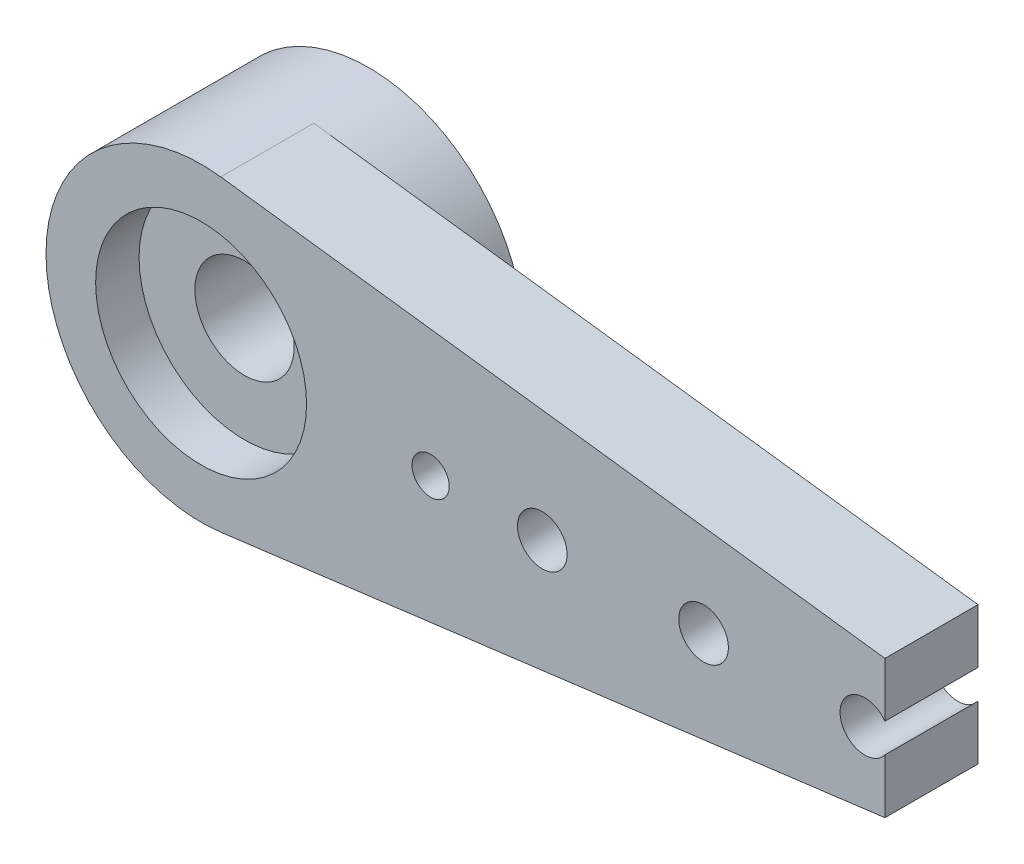
ISO-10303-21;
HEADER;
FILE_DESCRIPTION(('STEP AP214'),'2;1');
FILE_NAME('part.step','',(''),(''),'','','');
FILE_SCHEMA(('AUTOMOTIVE_DESIGN { 1 0 10303 214 1 1 1 1 }'));
ENDSEC;
DATA;
#1=APPLICATION_CONTEXT('core data for automotive mechanical design processes');
#2=APPLICATION_PROTOCOL_DEFINITION('international standard','automotive_design',2000,#1);
#3=PRODUCT_CONTEXT('',#1,'mechanical');
#4=PRODUCT('Part','Part','',(#3));
#5=PRODUCT_RELATED_PRODUCT_CATEGORY('part','',(#4));
#6=PRODUCT_DEFINITION_FORMATION('','',#4);
#7=PRODUCT_DEFINITION_CONTEXT('part definition',#1,'design');
#8=PRODUCT_DEFINITION('design','',#6,#7);
#9=PRODUCT_DEFINITION_SHAPE('','',#8);
#10=(LENGTH_UNIT() NAMED_UNIT(*) SI_UNIT(.MILLI.,.METRE.));
#11=(NAMED_UNIT(*) PLANE_ANGLE_UNIT() SI_UNIT($,.RADIAN.));
#12=(NAMED_UNIT(*) SI_UNIT($,.STERADIAN.) SOLID_ANGLE_UNIT());
#13=UNCERTAINTY_MEASURE_WITH_UNIT(LENGTH_MEASURE(1.E-05),#10,'distance_accuracy_value','');
#14=(GEOMETRIC_REPRESENTATION_CONTEXT(3) GLOBAL_UNCERTAINTY_ASSIGNED_CONTEXT((#13)) GLOBAL_UNIT_ASSIGNED_CONTEXT((#10,
#11,#12)) REPRESENTATION_CONTEXT('',''));
#15=CARTESIAN_POINT('',(0.,0.,0.));
#16=DIRECTION('',(0.,0.,1.));
#17=DIRECTION('',(1.,0.,0.));
#18=AXIS2_PLACEMENT_3D('',#15,#16,#17);
#19=CARTESIAN_POINT('',(0.,0.,1.905));
#20=DIRECTION('',(0.,0.,-1.));
#21=DIRECTION('',(-1.,0.,0.));
#22=AXIS2_PLACEMENT_3D('',#19,#20,#21);
#23=CYLINDRICAL_SURFACE('',#22,1.016);
#24=CARTESIAN_POINT('',(0.,0.,1.016));
#25=DIRECTION('',(0.,0.,1.));
#26=DIRECTION('',(1.,0.,0.));
#27=AXIS2_PLACEMENT_3D('',#24,#25,#26);
#28=CIRCLE('',#27,1.016);
#29=CARTESIAN_POINT('',(1.016,0.,1.016));
#30=VERTEX_POINT('',#29);
#31=EDGE_CURVE('E166',#30,#30,#28,.F.);
#32=ORIENTED_EDGE('',*,*,#31,.F.);
#33=EDGE_LOOP('',(#32));
#34=FACE_BOUND('',#33,.T.);
#35=CARTESIAN_POINT('',(0.,0.,-0.635));
#36=DIRECTION('',(0.,0.,-1.));
#37=DIRECTION('',(-1.,0.,0.));
#38=AXIS2_PLACEMENT_3D('',#35,#36,#37);
#39=CIRCLE('',#38,1.016);
#40=CARTESIAN_POINT('',(-1.016,0.,-0.635));
#41=VERTEX_POINT('',#40);
#42=EDGE_CURVE('E175',#41,#41,#39,.T.);
#43=ORIENTED_EDGE('',*,*,#42,.T.);
#44=EDGE_LOOP('',(#43));
#45=FACE_BOUND('',#44,.T.);
#46=ADVANCED_FACE('F43',(#34,#45),#23,.F.);
#47=CARTESIAN_POINT('',(0.,0.,1.905));
#48=DIRECTION('',(0.,0.,-1.));
#49=DIRECTION('',(-1.,0.,0.));
#50=AXIS2_PLACEMENT_3D('',#47,#48,#49);
#51=CYLINDRICAL_SURFACE('',#50,3.175);
#52=DIRECTION('',(0.,0.,-1.));
#53=VECTOR('',#52,1.);
#54=CARTESIAN_POINT('',(0.402335264301231,3.14940491761533,1.905));
#55=LINE('',#54,#53);
#56=CARTESIAN_POINT('',(0.402335264301231,3.14940491761533,1.905));
#57=VERTEX_POINT('',#56);
#58=CARTESIAN_POINT('',(0.402335264301231,3.14940491761533,0.));
#59=VERTEX_POINT('',#58);
#60=EDGE_CURVE('E137',#57,#59,#55,.T.);
#61=ORIENTED_EDGE('',*,*,#60,.T.);
#62=CARTESIAN_POINT('',(0.,0.,0.));
#63=DIRECTION('',(0.,0.,1.));
#64=DIRECTION('',(1.,0.,0.));
#65=AXIS2_PLACEMENT_3D('',#62,#63,#64);
#66=CIRCLE('',#65,3.175);
#67=CARTESIAN_POINT('',(0.402335264301231,-3.14940491761533,0.));
#68=VERTEX_POINT('',#67);
#69=EDGE_CURVE('E157',#68,#59,#66,.T.);
#70=ORIENTED_EDGE('',*,*,#69,.F.);
#71=DIRECTION('',(0.,0.,-1.));
#72=VECTOR('',#71,1.);
#73=CARTESIAN_POINT('',(0.402335264301231,-3.14940491761533,1.905));
#74=LINE('',#73,#72);
#75=CARTESIAN_POINT('',(0.402335264301231,-3.14940491761533,1.905));
#76=VERTEX_POINT('',#75);
#77=EDGE_CURVE('E156',#76,#68,#74,.T.);
#78=ORIENTED_EDGE('',*,*,#77,.F.);
#79=CARTESIAN_POINT('',(0.,0.,1.905));
#80=DIRECTION('',(0.,0.,1.));
#81=DIRECTION('',(1.,0.,0.));
#82=AXIS2_PLACEMENT_3D('',#79,#80,#81);
#83=CIRCLE('',#82,3.175);
#84=EDGE_CURVE('E116',#57,#76,#83,.T.);
#85=ORIENTED_EDGE('',*,*,#84,.F.);
#86=EDGE_LOOP('',(#61,#70,#78,#85));
#87=FACE_BOUND('',#86,.T.);
#88=CARTESIAN_POINT('',(0.,0.,-1.524));
#89=DIRECTION('',(0.,0.,1.));
#90=DIRECTION('',(1.,0.,0.));
#91=AXIS2_PLACEMENT_3D('',#88,#89,#90);
#92=CIRCLE('',#91,3.175);
#93=CARTESIAN_POINT('',(3.175,0.,-1.524));
#94=VERTEX_POINT('',#93);
#95=EDGE_CURVE('E140',#94,#94,#92,.T.);
#96=ORIENTED_EDGE('',*,*,#95,.T.);
#97=EDGE_LOOP('',(#96));
#98=FACE_BOUND('',#97,.T.);
#99=ADVANCED_FACE('F201',(#87,#98),#51,.T.);
#100=CARTESIAN_POINT('',(0.402335264301231,-3.14940491761533,1.905));
#101=DIRECTION('',(-0.126719768283852,0.99193855672924,0.));
#102=DIRECTION('',(-0.99193855672924,-0.126719768283852,0.));
#103=AXIS2_PLACEMENT_3D('',#100,#101,#102);
#104=PLANE('',#103);
#105=DIRECTION('',(0.99193855672924,0.126719768283852,0.));
#106=VECTOR('',#105,1.);
#107=CARTESIAN_POINT('',(0.402335264301231,-3.14940491761533,0.));
#108=LINE('',#107,#106);
#109=CARTESIAN_POINT('',(14.,-1.41230848878926,0.));
#110=VERTEX_POINT('',#109);
#111=EDGE_CURVE('E109',#68,#110,#108,.T.);
#112=ORIENTED_EDGE('',*,*,#111,.T.);
#113=DIRECTION('',(0.,0.,-1.));
#114=VECTOR('',#113,1.);
#115=CARTESIAN_POINT('',(14.,-1.41230848878926,1.905));
#116=LINE('',#115,#114);
#117=CARTESIAN_POINT('',(14.,-1.41230848878926,1.905));
#118=VERTEX_POINT('',#117);
#119=EDGE_CURVE('E64',#118,#110,#116,.T.);
#120=ORIENTED_EDGE('',*,*,#119,.F.);
#121=DIRECTION('',(0.99193855672924,0.126719768283852,0.));
#122=VECTOR('',#121,1.);
#123=CARTESIAN_POINT('',(0.402335264301231,-3.14940491761533,1.905));
#124=LINE('',#123,#122);
#125=EDGE_CURVE('E106',#76,#118,#124,.T.);
#126=ORIENTED_EDGE('',*,*,#125,.F.);
#127=ORIENTED_EDGE('',*,*,#77,.T.);
#128=EDGE_LOOP('',(#112,#120,#126,#127));
#129=FACE_BOUND('',#128,.T.);
#130=ADVANCED_FACE('F104',(#129),#104,.F.);
#131=CARTESIAN_POINT('',(6.985,0.,1.905));
#132=DIRECTION('',(0.,0.,-1.));
#133=DIRECTION('',(-1.,0.,0.));
#134=AXIS2_PLACEMENT_3D('',#131,#132,#133);
#135=CYLINDRICAL_SURFACE('',#134,0.508);
#136=CARTESIAN_POINT('',(6.985,0.,1.905));
#137=DIRECTION('',(0.,0.,1.));
#138=DIRECTION('',(1.,0.,0.));
#139=AXIS2_PLACEMENT_3D('',#136,#137,#138);
#140=CIRCLE('',#139,0.508);
#141=CARTESIAN_POINT('',(7.493,0.,1.905));
#142=VERTEX_POINT('',#141);
#143=EDGE_CURVE('E131',#142,#142,#140,.T.);
#144=ORIENTED_EDGE('',*,*,#143,.T.);
#145=EDGE_LOOP('',(#144));
#146=FACE_BOUND('',#145,.T.);
#147=CARTESIAN_POINT('',(6.985,0.,0.));
#148=DIRECTION('',(0.,0.,1.));
#149=DIRECTION('',(1.,0.,0.));
#150=AXIS2_PLACEMENT_3D('',#147,#148,#149);
#151=CIRCLE('',#150,0.508);
#152=CARTESIAN_POINT('',(7.493,0.,0.));
#153=VERTEX_POINT('',#152);
#154=EDGE_CURVE('E149',#153,#153,#151,.T.);
#155=ORIENTED_EDGE('',*,*,#154,.F.);
#156=EDGE_LOOP('',(#155));
#157=FACE_BOUND('',#156,.T.);
#158=ADVANCED_FACE('F245',(#146,#157),#135,.F.);
#159=CARTESIAN_POINT('',(10.287,0.,1.905));
#160=DIRECTION('',(0.,0.,-1.));
#161=DIRECTION('',(-1.,0.,0.));
#162=AXIS2_PLACEMENT_3D('',#159,#160,#161);
#163=CYLINDRICAL_SURFACE('',#162,0.508);
#164=CARTESIAN_POINT('',(10.287,0.,1.905));
#165=DIRECTION('',(0.,0.,1.));
#166=DIRECTION('',(1.,0.,0.));
#167=AXIS2_PLACEMENT_3D('',#164,#165,#166);
#168=CIRCLE('',#167,0.508);
#169=CARTESIAN_POINT('',(10.795,0.,1.905));
#170=VERTEX_POINT('',#169);
#171=EDGE_CURVE('E128',#170,#170,#168,.T.);
#172=ORIENTED_EDGE('',*,*,#171,.T.);
#173=EDGE_LOOP('',(#172));
#174=FACE_BOUND('',#173,.T.);
#175=CARTESIAN_POINT('',(10.287,0.,0.));
#176=DIRECTION('',(0.,0.,1.));
#177=DIRECTION('',(1.,0.,0.));
#178=AXIS2_PLACEMENT_3D('',#175,#176,#177);
#179=CIRCLE('',#178,0.508);
#180=CARTESIAN_POINT('',(10.795,0.,0.));
#181=VERTEX_POINT('',#180);
#182=EDGE_CURVE('E146',#181,#181,#179,.T.);
#183=ORIENTED_EDGE('',*,*,#182,.F.);
#184=EDGE_LOOP('',(#183));
#185=FACE_BOUND('',#184,.T.);
#186=ADVANCED_FACE('F248',(#174,#185),#163,.F.);
#187=CARTESIAN_POINT('',(13.589,0.,1.905));
#188=DIRECTION('',(0.,0.,-1.));
#189=DIRECTION('',(-1.,0.,0.));
#190=AXIS2_PLACEMENT_3D('',#187,#188,#189);
#191=CYLINDRICAL_SURFACE('',#190,0.508);
#192=DIRECTION('',(0.,0.,-1.));
#193=VECTOR('',#192,1.);
#194=CARTESIAN_POINT('',(14.,0.298568250153964,1.905));
#195=LINE('',#194,#193);
#196=CARTESIAN_POINT('',(14.,0.298568250153964,1.905));
#197=VERTEX_POINT('',#196);
#198=CARTESIAN_POINT('',(14.,0.298568250153964,0.));
#199=VERTEX_POINT('',#198);
#200=EDGE_CURVE('E57',#197,#199,#195,.T.);
#201=ORIENTED_EDGE('',*,*,#200,.F.);
#202=CARTESIAN_POINT('',(13.589,0.,1.905));
#203=DIRECTION('',(0.,0.,1.));
#204=DIRECTION('',(1.,0.,0.));
#205=AXIS2_PLACEMENT_3D('',#202,#203,#204);
#206=CIRCLE('',#205,0.508);
#207=CARTESIAN_POINT('',(14.,-0.298568250153964,1.905));
#208=VERTEX_POINT('',#207);
#209=EDGE_CURVE('E121',#197,#208,#206,.T.);
#210=ORIENTED_EDGE('',*,*,#209,.T.);
#211=DIRECTION('',(0.,0.,-1.));
#212=VECTOR('',#211,1.);
#213=CARTESIAN_POINT('',(14.,-0.298568250153964,1.905));
#214=LINE('',#213,#212);
#215=CARTESIAN_POINT('',(14.,-0.298568250153964,0.));
#216=VERTEX_POINT('',#215);
#217=EDGE_CURVE('E95',#208,#216,#214,.T.);
#218=ORIENTED_EDGE('',*,*,#217,.T.);
#219=CARTESIAN_POINT('',(13.589,0.,0.));
#220=DIRECTION('',(0.,0.,1.));
#221=DIRECTION('',(1.,0.,0.));
#222=AXIS2_PLACEMENT_3D('',#219,#220,#221);
#223=CIRCLE('',#222,0.508);
#224=EDGE_CURVE('E143',#199,#216,#223,.T.);
#225=ORIENTED_EDGE('',*,*,#224,.F.);
#226=EDGE_LOOP('',(#201,#210,#218,#225));
#227=FACE_BOUND('',#226,.T.);
#228=ADVANCED_FACE('F191',(#227),#191,.F.);
#229=CARTESIAN_POINT('',(0.402335264301231,3.14940491761533,1.905));
#230=DIRECTION('',(0.126719768283852,0.99193855672924,0.));
#231=DIRECTION('',(-0.99193855672924,0.126719768283852,0.));
#232=AXIS2_PLACEMENT_3D('',#229,#230,#231);
#233=PLANE('',#232);
#234=DIRECTION('',(0.,0.,-1.));
#235=VECTOR('',#234,1.);
#236=CARTESIAN_POINT('',(14.,1.41230848878926,1.905));
#237=LINE('',#236,#235);
#238=CARTESIAN_POINT('',(14.,1.41230848878926,1.905));
#239=VERTEX_POINT('',#238);
#240=CARTESIAN_POINT('',(14.,1.41230848878926,0.));
#241=VERTEX_POINT('',#240);
#242=EDGE_CURVE('E179',#239,#241,#237,.T.);
#243=ORIENTED_EDGE('',*,*,#242,.T.);
#244=DIRECTION('',(0.99193855672924,-0.126719768283852,0.));
#245=VECTOR('',#244,1.);
#246=CARTESIAN_POINT('',(0.402335264301231,3.14940491761533,0.));
#247=LINE('',#246,#245);
#248=EDGE_CURVE('E139',#59,#241,#247,.T.);
#249=ORIENTED_EDGE('',*,*,#248,.F.);
#250=ORIENTED_EDGE('',*,*,#60,.F.);
#251=DIRECTION('',(0.99193855672924,-0.126719768283852,0.));
#252=VECTOR('',#251,1.);
#253=CARTESIAN_POINT('',(0.402335264301231,3.14940491761533,1.905));
#254=LINE('',#253,#252);
#255=EDGE_CURVE('E118',#57,#239,#254,.T.);
#256=ORIENTED_EDGE('',*,*,#255,.T.);
#257=EDGE_LOOP('',(#243,#249,#250,#256));
#258=FACE_BOUND('',#257,.T.);
#259=ADVANCED_FACE('F186',(#258),#233,.T.);
#260=CARTESIAN_POINT('',(4.699,0.,1.905));
#261=DIRECTION('',(0.,0.,-1.));
#262=DIRECTION('',(-1.,0.,0.));
#263=AXIS2_PLACEMENT_3D('',#260,#261,#262);
#264=CYLINDRICAL_SURFACE('',#263,0.381000000000001);
#265=CARTESIAN_POINT('',(4.699,0.,1.905));
#266=DIRECTION('',(0.,0.,1.));
#267=DIRECTION('',(1.,0.,0.));
#268=AXIS2_PLACEMENT_3D('',#265,#266,#267);
#269=CIRCLE('',#268,0.381000000000001);
#270=CARTESIAN_POINT('',(5.08,0.,1.905));
#271=VERTEX_POINT('',#270);
#272=EDGE_CURVE('E134',#271,#271,#269,.T.);
#273=ORIENTED_EDGE('',*,*,#272,.T.);
#274=EDGE_LOOP('',(#273));
#275=FACE_BOUND('',#274,.T.);
#276=CARTESIAN_POINT('',(4.699,0.,0.));
#277=DIRECTION('',(0.,0.,1.));
#278=DIRECTION('',(1.,0.,0.));
#279=AXIS2_PLACEMENT_3D('',#276,#277,#278);
#280=CIRCLE('',#279,0.381000000000001);
#281=CARTESIAN_POINT('',(5.08,0.,0.));
#282=VERTEX_POINT('',#281);
#283=EDGE_CURVE('E123',#282,#282,#280,.T.);
#284=ORIENTED_EDGE('',*,*,#283,.F.);
#285=EDGE_LOOP('',(#284));
#286=FACE_BOUND('',#285,.T.);
#287=ADVANCED_FACE('F240',(#275,#286),#264,.F.);
#288=CARTESIAN_POINT('',(0.,0.,1.905));
#289=DIRECTION('',(0.,0.,1.));
#290=DIRECTION('',(1.,0.,0.));
#291=AXIS2_PLACEMENT_3D('',#288,#289,#290);
#292=PLANE('',#291);
#293=DIRECTION('',(0.,1.,0.));
#294=VECTOR('',#293,1.);
#295=CARTESIAN_POINT('',(14.,0.,1.905));
#296=LINE('',#295,#294);
#297=EDGE_CURVE('E100',#197,#239,#296,.T.);
#298=ORIENTED_EDGE('',*,*,#297,.T.);
#299=ORIENTED_EDGE('',*,*,#255,.F.);
#300=ORIENTED_EDGE('',*,*,#84,.T.);
#301=ORIENTED_EDGE('',*,*,#125,.T.);
#302=EDGE_CURVE('E92',#118,#208,#296,.T.);
#303=ORIENTED_EDGE('',*,*,#302,.T.);
#304=ORIENTED_EDGE('',*,*,#209,.F.);
#305=EDGE_LOOP('',(#298,#299,#300,#301,#303,#304));
#306=FACE_BOUND('',#305,.T.);
#307=CARTESIAN_POINT('',(0.,0.,1.905));
#308=DIRECTION('',(0.,0.,1.));
#309=DIRECTION('',(1.,0.,0.));
#310=AXIS2_PLACEMENT_3D('',#307,#308,#309);
#311=CIRCLE('',#310,2.15899987554);
#312=CARTESIAN_POINT('',(2.15899987554,0.,1.905));
#313=VERTEX_POINT('',#312);
#314=EDGE_CURVE('E163',#313,#313,#311,.T.);
#315=ORIENTED_EDGE('',*,*,#314,.F.);
#316=EDGE_LOOP('',(#315));
#317=FACE_BOUND('',#316,.T.);
#318=ORIENTED_EDGE('',*,*,#171,.F.);
#319=EDGE_LOOP('',(#318));
#320=FACE_BOUND('',#319,.T.);
#321=ORIENTED_EDGE('',*,*,#143,.F.);
#322=EDGE_LOOP('',(#321));
#323=FACE_BOUND('',#322,.T.);
#324=ORIENTED_EDGE('',*,*,#272,.F.);
#325=EDGE_LOOP('',(#324));
#326=FACE_BOUND('',#325,.T.);
#327=ADVANCED_FACE('F112',(#306,#317,#320,#323,#326),#292,.T.);
#328=CARTESIAN_POINT('',(0.,0.,0.));
#329=DIRECTION('',(0.,0.,1.));
#330=DIRECTION('',(1.,0.,0.));
#331=AXIS2_PLACEMENT_3D('',#328,#329,#330);
#332=PLANE('',#331);
#333=ORIENTED_EDGE('',*,*,#248,.T.);
#334=DIRECTION('',(0.,-1.,0.));
#335=VECTOR('',#334,1.);
#336=CARTESIAN_POINT('',(14.,0.,0.));
#337=LINE('',#336,#335);
#338=EDGE_CURVE('E11',#241,#199,#337,.T.);
#339=ORIENTED_EDGE('',*,*,#338,.T.);
#340=ORIENTED_EDGE('',*,*,#224,.T.);
#341=DIRECTION('',(0.,-1.,0.));
#342=VECTOR('',#341,1.);
#343=CARTESIAN_POINT('',(14.,0.,0.));
#344=LINE('',#343,#342);
#345=EDGE_CURVE('E50',#216,#110,#344,.T.);
#346=ORIENTED_EDGE('',*,*,#345,.T.);
#347=ORIENTED_EDGE('',*,*,#111,.F.);
#348=ORIENTED_EDGE('',*,*,#69,.T.);
#349=EDGE_LOOP('',(#333,#339,#340,#346,#347,#348));
#350=FACE_BOUND('',#349,.T.);
#351=ORIENTED_EDGE('',*,*,#182,.T.);
#352=EDGE_LOOP('',(#351));
#353=FACE_BOUND('',#352,.T.);
#354=ORIENTED_EDGE('',*,*,#154,.T.);
#355=EDGE_LOOP('',(#354));
#356=FACE_BOUND('',#355,.T.);
#357=ORIENTED_EDGE('',*,*,#283,.T.);
#358=EDGE_LOOP('',(#357));
#359=FACE_BOUND('',#358,.T.);
#360=ADVANCED_FACE('F187',(#350,#353,#356,#359),#332,.F.);
#361=CARTESIAN_POINT('',(0.,0.,-1.524));
#362=DIRECTION('',(0.,0.,1.));
#363=DIRECTION('',(1.,0.,0.));
#364=AXIS2_PLACEMENT_3D('',#361,#362,#363);
#365=PLANE('',#364);
#366=CARTESIAN_POINT('',(0.,0.,-1.524));
#367=DIRECTION('',(0.,0.,-1.));
#368=DIRECTION('',(-1.,0.,0.));
#369=AXIS2_PLACEMENT_3D('',#366,#367,#368);
#370=CIRCLE('',#369,2.09550000254);
#371=CARTESIAN_POINT('',(-2.09550000254,0.,-1.524));
#372=VERTEX_POINT('',#371);
#373=EDGE_CURVE('E172',#372,#372,#370,.T.);
#374=ORIENTED_EDGE('',*,*,#373,.F.);
#375=EDGE_LOOP('',(#374));
#376=FACE_BOUND('',#375,.T.);
#377=ORIENTED_EDGE('',*,*,#95,.F.);
#378=EDGE_LOOP('',(#377));
#379=FACE_BOUND('',#378,.T.);
#380=ADVANCED_FACE('F224',(#376,#379),#365,.F.);
#381=CARTESIAN_POINT('',(0.,0.,1.016));
#382=DIRECTION('',(0.,0.,1.));
#383=DIRECTION('',(1.,0.,0.));
#384=AXIS2_PLACEMENT_3D('',#381,#382,#383);
#385=CYLINDRICAL_SURFACE('',#384,2.15899987554);
#386=CARTESIAN_POINT('',(0.,0.,1.016));
#387=DIRECTION('',(0.,0.,1.));
#388=DIRECTION('',(1.,0.,0.));
#389=AXIS2_PLACEMENT_3D('',#386,#387,#388);
#390=CIRCLE('',#389,2.15899987554);
#391=CARTESIAN_POINT('',(2.15899987554,0.,1.016));
#392=VERTEX_POINT('',#391);
#393=EDGE_CURVE('E162',#392,#392,#390,.T.);
#394=CARTESIAN_POINT('',(2.15899987554,0.,1.016));
#395=CARTESIAN_POINT('',(2.15899987554,0.,1.02526041666667));
#396=CARTESIAN_POINT('',(2.15899987554,0.,1.03452083333333));
#397=CARTESIAN_POINT('',(2.15899987554,0.,1.05304166666667));
#398=CARTESIAN_POINT('',(2.15899987554,0.,1.06230208333333));
#399=CARTESIAN_POINT('',(2.15899987554,0.,1.08082291666667));
#400=CARTESIAN_POINT('',(2.15899987554,0.,1.09008333333333));
#401=CARTESIAN_POINT('',(2.15899987554,0.,1.10860416666667));
#402=CARTESIAN_POINT('',(2.15899987554,0.,1.11786458333333));
#403=CARTESIAN_POINT('',(2.15899987554,0.,1.13638541666667));
#404=CARTESIAN_POINT('',(2.15899987554,0.,1.14564583333333));
#405=CARTESIAN_POINT('',(2.15899987554,0.,1.16416666666667));
#406=CARTESIAN_POINT('',(2.15899987554,0.,1.17342708333333));
#407=CARTESIAN_POINT('',(2.15899987554,0.,1.19194791666667));
#408=CARTESIAN_POINT('',(2.15899987554,0.,1.20120833333333));
#409=CARTESIAN_POINT('',(2.15899987554,0.,1.21972916666667));
#410=CARTESIAN_POINT('',(2.15899987554,0.,1.22898958333333));
#411=CARTESIAN_POINT('',(2.15899987554,0.,1.24751041666667));
#412=CARTESIAN_POINT('',(2.15899987554,0.,1.25677083333333));
#413=CARTESIAN_POINT('',(2.15899987554,0.,1.27529166666667));
#414=CARTESIAN_POINT('',(2.15899987554,0.,1.28455208333333));
#415=CARTESIAN_POINT('',(2.15899987554,0.,1.30307291666667));
#416=CARTESIAN_POINT('',(2.15899987554,0.,1.31233333333333));
#417=CARTESIAN_POINT('',(2.15899987554,0.,1.33085416666667));
#418=CARTESIAN_POINT('',(2.15899987554,0.,1.34011458333333));
#419=CARTESIAN_POINT('',(2.15899987554,0.,1.35863541666667));
#420=CARTESIAN_POINT('',(2.15899987554,0.,1.36789583333333));
#421=CARTESIAN_POINT('',(2.15899987554,0.,1.38641666666667));
#422=CARTESIAN_POINT('',(2.15899987554,0.,1.39567708333333));
#423=CARTESIAN_POINT('',(2.15899987554,0.,1.41419791666667));
#424=CARTESIAN_POINT('',(2.15899987554,0.,1.42345833333333));
#425=CARTESIAN_POINT('',(2.15899987554,0.,1.44197916666667));
#426=CARTESIAN_POINT('',(2.15899987554,0.,1.45123958333333));
#427=CARTESIAN_POINT('',(2.15899987554,0.,1.46976041666667));
#428=CARTESIAN_POINT('',(2.15899987554,0.,1.47902083333333));
#429=CARTESIAN_POINT('',(2.15899987554,0.,1.49754166666667));
#430=CARTESIAN_POINT('',(2.15899987554,0.,1.50680208333333));
#431=CARTESIAN_POINT('',(2.15899987554,0.,1.52532291666667));
#432=CARTESIAN_POINT('',(2.15899987554,0.,1.53458333333333));
#433=CARTESIAN_POINT('',(2.15899987554,0.,1.55310416666667));
#434=CARTESIAN_POINT('',(2.15899987554,0.,1.56236458333333));
#435=CARTESIAN_POINT('',(2.15899987554,0.,1.58088541666667));
#436=CARTESIAN_POINT('',(2.15899987554,0.,1.59014583333333));
#437=CARTESIAN_POINT('',(2.15899987554,0.,1.60866666666667));
#438=CARTESIAN_POINT('',(2.15899987554,0.,1.61792708333333));
#439=CARTESIAN_POINT('',(2.15899987554,0.,1.63644791666667));
#440=CARTESIAN_POINT('',(2.15899987554,0.,1.64570833333333));
#441=CARTESIAN_POINT('',(2.15899987554,0.,1.66422916666667));
#442=CARTESIAN_POINT('',(2.15899987554,0.,1.67348958333333));
#443=CARTESIAN_POINT('',(2.15899987554,0.,1.69201041666667));
#444=CARTESIAN_POINT('',(2.15899987554,0.,1.70127083333333));
#445=CARTESIAN_POINT('',(2.15899987554,0.,1.71979166666667));
#446=CARTESIAN_POINT('',(2.15899987554,0.,1.72905208333333));
#447=CARTESIAN_POINT('',(2.15899987554,0.,1.74757291666667));
#448=CARTESIAN_POINT('',(2.15899987554,0.,1.75683333333333));
#449=CARTESIAN_POINT('',(2.15899987554,0.,1.77535416666667));
#450=CARTESIAN_POINT('',(2.15899987554,0.,1.78461458333333));
#451=CARTESIAN_POINT('',(2.15899987554,0.,1.80313541666667));
#452=CARTESIAN_POINT('',(2.15899987554,0.,1.81239583333333));
#453=CARTESIAN_POINT('',(2.15899987554,0.,1.83091666666667));
#454=CARTESIAN_POINT('',(2.15899987554,0.,1.84017708333333));
#455=CARTESIAN_POINT('',(2.15899987554,0.,1.85869791666667));
#456=CARTESIAN_POINT('',(2.15899987554,0.,1.86795833333333));
#457=CARTESIAN_POINT('',(2.15899987554,0.,1.88647916666667));
#458=CARTESIAN_POINT('',(2.15899987554,0.,1.89573958333333));
#459=CARTESIAN_POINT('',(2.15899987554,0.,1.905));
#460=B_SPLINE_CURVE_WITH_KNOTS('',3,(#394,#395,#396,#397,#398,#399,#400,#401,#402,#403,#404,
#405,#406,#407,#408,#409,#410,#411,#412,#413,#414,#415,#416,#417,#418,#419,#420,#421,#422,#423,
#424,#425,#426,#427,#428,#429,#430,#431,#432,#433,#434,#435,#436,#437,#438,#439,#440,#441,#442,
#443,#444,#445,#446,#447,#448,#449,#450,#451,#452,#453,#454,#455,#456,#457,#458,#459),
.UNSPECIFIED.,.F.,.F.,(4,2,2,2,2,2,2,2,2,2,2,2,2,2,2,2,2,2,2,2,2,2,2,2,2,2,2,2,2,2,2,2,4),(0.,
0.02778125,0.0555625000000001,0.0833437500000001,0.111125,0.13890625,0.1666875,0.19446875,
0.22225,0.25003125,0.2778125,0.30559375,0.333375,0.36115625,0.3889375,0.41671875,0.4445,
0.47228125,0.5000625,0.52784375,0.555625,0.58340625,0.6111875,0.63896875,0.66675,0.69453125,
0.7223125,0.75009375,0.777875,0.80565625,0.8334375,0.86121875,0.889),.UNSPECIFIED.);
#461=EDGE_CURVE('BSEAM226',#392,#313,#460,.T.);
#462=ORIENTED_EDGE('',*,*,#393,.F.);
#463=ORIENTED_EDGE('',*,*,#314,.T.);
#464=ORIENTED_EDGE('',*,*,#461,.T.);
#465=ORIENTED_EDGE('',*,*,#461,.F.);
#466=EDGE_LOOP('',(#462,#464,#463,#465));
#467=FACE_BOUND('',#466,.T.);
#468=ADVANCED_FACE('F226',(#467),#385,.F.);
#469=CARTESIAN_POINT('',(0.,0.,1.016));
#470=DIRECTION('',(0.,0.,1.));
#471=DIRECTION('',(1.,0.,0.));
#472=AXIS2_PLACEMENT_3D('',#469,#470,#471);
#473=PLANE('',#472);
#474=ORIENTED_EDGE('',*,*,#31,.T.);
#475=EDGE_LOOP('',(#474));
#476=FACE_BOUND('',#475,.T.);
#477=ORIENTED_EDGE('',*,*,#393,.T.);
#478=EDGE_LOOP('',(#477));
#479=FACE_BOUND('',#478,.T.);
#480=ADVANCED_FACE('F220',(#476,#479),#473,.T.);
#481=CARTESIAN_POINT('',(0.,0.,-0.635));
#482=DIRECTION('',(0.,0.,-1.));
#483=DIRECTION('',(-1.,0.,0.));
#484=AXIS2_PLACEMENT_3D('',#481,#482,#483);
#485=CYLINDRICAL_SURFACE('',#484,2.09550000254);
#486=CARTESIAN_POINT('',(0.,0.,-0.635));
#487=DIRECTION('',(0.,0.,-1.));
#488=DIRECTION('',(-1.,0.,0.));
#489=AXIS2_PLACEMENT_3D('',#486,#487,#488);
#490=CIRCLE('',#489,2.09550000254);
#491=CARTESIAN_POINT('',(-2.09550000254,0.,-0.635));
#492=VERTEX_POINT('',#491);
#493=EDGE_CURVE('E167',#492,#492,#490,.T.);
#494=CARTESIAN_POINT('',(-2.09550000254,0.,-0.635));
#495=CARTESIAN_POINT('',(-2.09550000254,0.,-0.644260416666667));
#496=CARTESIAN_POINT('',(-2.09550000254,0.,-0.653520833333333));
#497=CARTESIAN_POINT('',(-2.09550000254,0.,-0.672041666666667));
#498=CARTESIAN_POINT('',(-2.09550000254,0.,-0.681302083333333));
#499=CARTESIAN_POINT('',(-2.09550000254,0.,-0.699822916666667));
#500=CARTESIAN_POINT('',(-2.09550000254,0.,-0.709083333333333));
#501=CARTESIAN_POINT('',(-2.09550000254,0.,-0.727604166666667));
#502=CARTESIAN_POINT('',(-2.09550000254,0.,-0.736864583333333));
#503=CARTESIAN_POINT('',(-2.09550000254,0.,-0.755385416666667));
#504=CARTESIAN_POINT('',(-2.09550000254,0.,-0.764645833333333));
#505=CARTESIAN_POINT('',(-2.09550000254,0.,-0.783166666666667));
#506=CARTESIAN_POINT('',(-2.09550000254,0.,-0.792427083333333));
#507=CARTESIAN_POINT('',(-2.09550000254,0.,-0.810947916666667));
#508=CARTESIAN_POINT('',(-2.09550000254,0.,-0.820208333333333));
#509=CARTESIAN_POINT('',(-2.09550000254,0.,-0.838729166666667));
#510=CARTESIAN_POINT('',(-2.09550000254,0.,-0.847989583333333));
#511=CARTESIAN_POINT('',(-2.09550000254,0.,-0.866510416666667));
#512=CARTESIAN_POINT('',(-2.09550000254,0.,-0.875770833333333));
#513=CARTESIAN_POINT('',(-2.09550000254,0.,-0.894291666666667));
#514=CARTESIAN_POINT('',(-2.09550000254,0.,-0.903552083333333));
#515=CARTESIAN_POINT('',(-2.09550000254,0.,-0.922072916666667));
#516=CARTESIAN_POINT('',(-2.09550000254,0.,-0.931333333333333));
#517=CARTESIAN_POINT('',(-2.09550000254,0.,-0.949854166666667));
#518=CARTESIAN_POINT('',(-2.09550000254,0.,-0.959114583333333));
#519=CARTESIAN_POINT('',(-2.09550000254,0.,-0.977635416666667));
#520=CARTESIAN_POINT('',(-2.09550000254,0.,-0.986895833333333));
#521=CARTESIAN_POINT('',(-2.09550000254,0.,-1.00541666666667));
#522=CARTESIAN_POINT('',(-2.09550000254,0.,-1.01467708333333));
#523=CARTESIAN_POINT('',(-2.09550000254,0.,-1.03319791666667));
#524=CARTESIAN_POINT('',(-2.09550000254,0.,-1.04245833333333));
#525=CARTESIAN_POINT('',(-2.09550000254,0.,-1.06097916666667));
#526=CARTESIAN_POINT('',(-2.09550000254,0.,-1.07023958333333));
#527=CARTESIAN_POINT('',(-2.09550000254,0.,-1.08876041666667));
#528=CARTESIAN_POINT('',(-2.09550000254,0.,-1.09802083333333));
#529=CARTESIAN_POINT('',(-2.09550000254,0.,-1.11654166666667));
#530=CARTESIAN_POINT('',(-2.09550000254,0.,-1.12580208333333));
#531=CARTESIAN_POINT('',(-2.09550000254,0.,-1.14432291666667));
#532=CARTESIAN_POINT('',(-2.09550000254,0.,-1.15358333333333));
#533=CARTESIAN_POINT('',(-2.09550000254,0.,-1.17210416666667));
#534=CARTESIAN_POINT('',(-2.09550000254,0.,-1.18136458333333));
#535=CARTESIAN_POINT('',(-2.09550000254,0.,-1.19988541666667));
#536=CARTESIAN_POINT('',(-2.09550000254,0.,-1.20914583333333));
#537=CARTESIAN_POINT('',(-2.09550000254,0.,-1.22766666666667));
#538=CARTESIAN_POINT('',(-2.09550000254,0.,-1.23692708333333));
#539=CARTESIAN_POINT('',(-2.09550000254,0.,-1.25544791666667));
#540=CARTESIAN_POINT('',(-2.09550000254,0.,-1.26470833333333));
#541=CARTESIAN_POINT('',(-2.09550000254,0.,-1.28322916666667));
#542=CARTESIAN_POINT('',(-2.09550000254,0.,-1.29248958333333));
#543=CARTESIAN_POINT('',(-2.09550000254,0.,-1.31101041666667));
#544=CARTESIAN_POINT('',(-2.09550000254,0.,-1.32027083333333));
#545=CARTESIAN_POINT('',(-2.09550000254,0.,-1.33879166666667));
#546=CARTESIAN_POINT('',(-2.09550000254,0.,-1.34805208333333));
#547=CARTESIAN_POINT('',(-2.09550000254,0.,-1.36657291666667));
#548=CARTESIAN_POINT('',(-2.09550000254,0.,-1.37583333333333));
#549=CARTESIAN_POINT('',(-2.09550000254,0.,-1.39435416666667));
#550=CARTESIAN_POINT('',(-2.09550000254,0.,-1.40361458333333));
#551=CARTESIAN_POINT('',(-2.09550000254,0.,-1.42213541666667));
#552=CARTESIAN_POINT('',(-2.09550000254,0.,-1.43139583333333));
#553=CARTESIAN_POINT('',(-2.09550000254,0.,-1.44991666666667));
#554=CARTESIAN_POINT('',(-2.09550000254,0.,-1.45917708333333));
#555=CARTESIAN_POINT('',(-2.09550000254,0.,-1.47769791666667));
#556=CARTESIAN_POINT('',(-2.09550000254,0.,-1.48695833333333));
#557=CARTESIAN_POINT('',(-2.09550000254,0.,-1.50547916666667));
#558=CARTESIAN_POINT('',(-2.09550000254,0.,-1.51473958333333));
#559=CARTESIAN_POINT('',(-2.09550000254,0.,-1.524));
#560=B_SPLINE_CURVE_WITH_KNOTS('',3,(#494,#495,#496,#497,#498,#499,#500,#501,#502,#503,#504,
#505,#506,#507,#508,#509,#510,#511,#512,#513,#514,#515,#516,#517,#518,#519,#520,#521,#522,#523,
#524,#525,#526,#527,#528,#529,#530,#531,#532,#533,#534,#535,#536,#537,#538,#539,#540,#541,#542,
#543,#544,#545,#546,#547,#548,#549,#550,#551,#552,#553,#554,#555,#556,#557,#558,#559),
.UNSPECIFIED.,.F.,.F.,(4,2,2,2,2,2,2,2,2,2,2,2,2,2,2,2,2,2,2,2,2,2,2,2,2,2,2,2,2,2,2,2,4),(0.,
0.02778125,0.0555625000000001,0.0833437500000001,0.111125,0.13890625,0.1666875,0.19446875,
0.22225,0.25003125,0.2778125,0.30559375,0.333375,0.36115625,0.3889375,0.41671875,0.4445,
0.47228125,0.5000625,0.52784375,0.555625,0.58340625,0.6111875,0.63896875,0.66675,0.69453125,
0.7223125,0.75009375,0.777875,0.80565625,0.8334375,0.86121875,0.889),.UNSPECIFIED.);
#561=EDGE_CURVE('BSEAM215',#492,#372,#560,.T.);
#562=ORIENTED_EDGE('',*,*,#493,.F.);
#563=ORIENTED_EDGE('',*,*,#373,.T.);
#564=ORIENTED_EDGE('',*,*,#561,.T.);
#565=ORIENTED_EDGE('',*,*,#561,.F.);
#566=EDGE_LOOP('',(#562,#564,#563,#565));
#567=FACE_BOUND('',#566,.T.);
#568=ADVANCED_FACE('F215',(#567),#485,.F.);
#569=CARTESIAN_POINT('',(0.,0.,-0.635));
#570=DIRECTION('',(0.,0.,-1.));
#571=DIRECTION('',(-1.,0.,0.));
#572=AXIS2_PLACEMENT_3D('',#569,#570,#571);
#573=PLANE('',#572);
#574=ORIENTED_EDGE('',*,*,#42,.F.);
#575=EDGE_LOOP('',(#574));
#576=FACE_BOUND('',#575,.T.);
#577=ORIENTED_EDGE('',*,*,#493,.T.);
#578=EDGE_LOOP('',(#577));
#579=FACE_BOUND('',#578,.T.);
#580=ADVANCED_FACE('F198',(#576,#579),#573,.T.);
#581=CARTESIAN_POINT('',(14.,0.,1.905));
#582=DIRECTION('',(-1.,0.,0.));
#583=DIRECTION('',(0.,0.,1.));
#584=AXIS2_PLACEMENT_3D('',#581,#582,#583);
#585=PLANE('',#584);
#586=ORIENTED_EDGE('',*,*,#217,.F.);
#587=ORIENTED_EDGE('',*,*,#302,.F.);
#588=ORIENTED_EDGE('',*,*,#119,.T.);
#589=ORIENTED_EDGE('',*,*,#345,.F.);
#590=EDGE_LOOP('',(#586,#587,#588,#589));
#591=FACE_BOUND('',#590,.T.);
#592=ADVANCED_FACE('F93',(#591),#585,.F.);
#593=ORIENTED_EDGE('',*,*,#242,.F.);
#594=ORIENTED_EDGE('',*,*,#297,.F.);
#595=ORIENTED_EDGE('',*,*,#200,.T.);
#596=ORIENTED_EDGE('',*,*,#338,.F.);
#597=EDGE_LOOP('',(#593,#594,#595,#596));
#598=FACE_BOUND('',#597,.T.);
#599=ADVANCED_FACE('F192',(#598),#585,.F.);
#600=CLOSED_SHELL('',(#46,#99,#130,#158,#186,#228,#259,#287,#327,#360,#380,#468,#480,#568,#580,
#592,#599));
#601=MANIFOLD_SOLID_BREP('B2',#600);
#602=ADVANCED_BREP_SHAPE_REPRESENTATION('',(#18,#601),#14);
#603=SHAPE_DEFINITION_REPRESENTATION(#9,#602);
ENDSEC;
END-ISO-10303-21;
